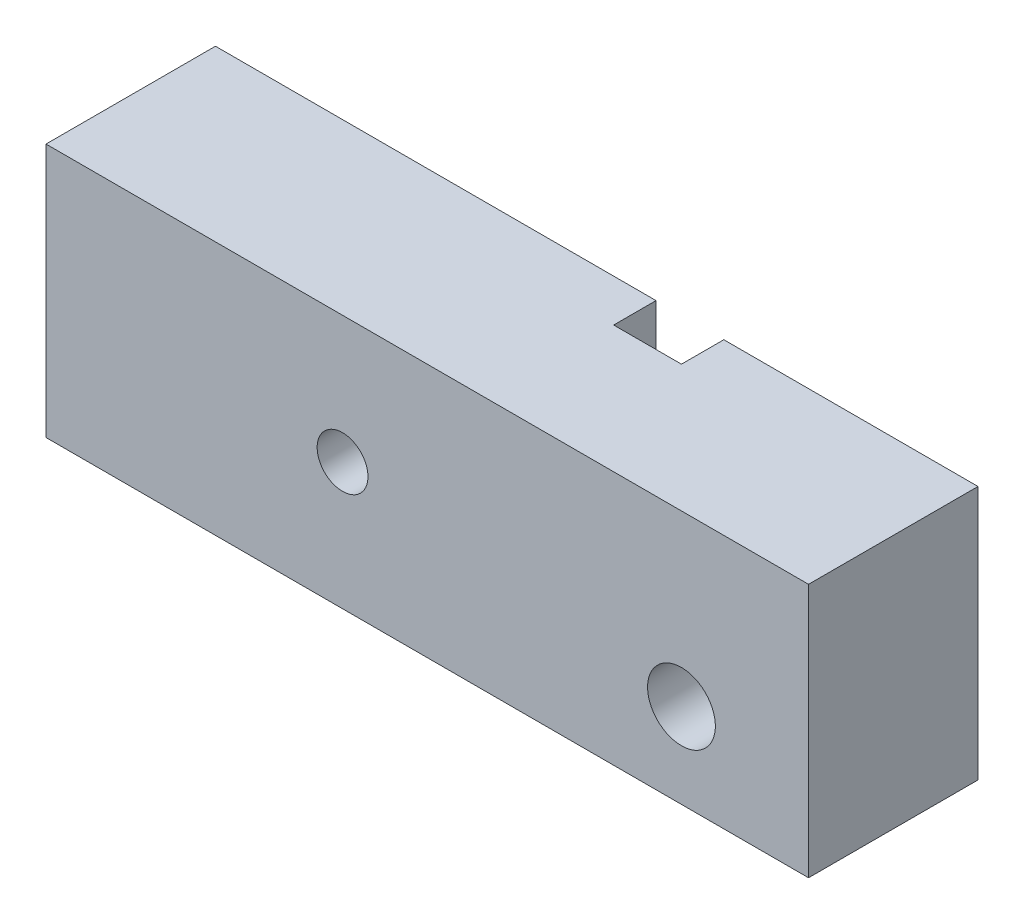
ISO-10303-21;
HEADER;
FILE_DESCRIPTION(('STEP AP214'),'2;1');
FILE_NAME('part.step','',(''),(''),'','','');
FILE_SCHEMA(('AUTOMOTIVE_DESIGN { 1 0 10303 214 1 1 1 1 }'));
ENDSEC;
DATA;
#1=APPLICATION_CONTEXT('core data for automotive mechanical design processes');
#2=APPLICATION_PROTOCOL_DEFINITION('international standard','automotive_design',2000,#1);
#3=PRODUCT_CONTEXT('',#1,'mechanical');
#4=PRODUCT('Part','Part','',(#3));
#5=PRODUCT_RELATED_PRODUCT_CATEGORY('part','',(#4));
#6=PRODUCT_DEFINITION_FORMATION('','',#4);
#7=PRODUCT_DEFINITION_CONTEXT('part definition',#1,'design');
#8=PRODUCT_DEFINITION('design','',#6,#7);
#9=PRODUCT_DEFINITION_SHAPE('','',#8);
#10=(LENGTH_UNIT() NAMED_UNIT(*) SI_UNIT(.MILLI.,.METRE.));
#11=(NAMED_UNIT(*) PLANE_ANGLE_UNIT() SI_UNIT($,.RADIAN.));
#12=(NAMED_UNIT(*) SI_UNIT($,.STERADIAN.) SOLID_ANGLE_UNIT());
#13=UNCERTAINTY_MEASURE_WITH_UNIT(LENGTH_MEASURE(1.E-05),#10,'distance_accuracy_value','');
#14=(GEOMETRIC_REPRESENTATION_CONTEXT(3) GLOBAL_UNCERTAINTY_ASSIGNED_CONTEXT((#13)) GLOBAL_UNIT_ASSIGNED_CONTEXT((#10,
#11,#12)) REPRESENTATION_CONTEXT('',''));
#15=CARTESIAN_POINT('',(0.,0.,0.));
#16=DIRECTION('',(0.,0.,1.));
#17=DIRECTION('',(1.,0.,0.));
#18=AXIS2_PLACEMENT_3D('',#15,#16,#17);
#19=CARTESIAN_POINT('',(0.,0.,0.));
#20=DIRECTION('',(0.,0.,-1.));
#21=DIRECTION('',(-1.,0.,0.));
#22=AXIS2_PLACEMENT_3D('',#19,#20,#21);
#23=PLANE('',#22);
#24=DIRECTION('',(0.,1.,0.));
#25=VECTOR('',#24,1.);
#26=CARTESIAN_POINT('',(7.00000000000001,-15.,0.));
#27=LINE('',#26,#25);
#28=CARTESIAN_POINT('',(7.00000000000001,-15.,0.));
#29=VERTEX_POINT('',#28);
#30=CARTESIAN_POINT('',(7.00000000000001,15.,0.));
#31=VERTEX_POINT('',#30);
#32=EDGE_CURVE('E158',#29,#31,#27,.T.);
#33=ORIENTED_EDGE('',*,*,#32,.F.);
#34=DIRECTION('',(1.,0.,0.));
#35=VECTOR('',#34,1.);
#36=CARTESIAN_POINT('',(-45.,-15.,0.));
#37=LINE('',#36,#35);
#38=CARTESIAN_POINT('',(-45.,-15.,0.));
#39=VERTEX_POINT('',#38);
#40=EDGE_CURVE('E145',#39,#29,#37,.T.);
#41=ORIENTED_EDGE('',*,*,#40,.F.);
#42=DIRECTION('',(0.,-1.,0.));
#43=VECTOR('',#42,1.);
#44=CARTESIAN_POINT('',(-45.,-15.,0.));
#45=LINE('',#44,#43);
#46=CARTESIAN_POINT('',(-45.,15.,0.));
#47=VERTEX_POINT('',#46);
#48=EDGE_CURVE('E196',#47,#39,#45,.T.);
#49=ORIENTED_EDGE('',*,*,#48,.F.);
#50=DIRECTION('',(-1.,0.,0.));
#51=VECTOR('',#50,1.);
#52=CARTESIAN_POINT('',(-45.,15.,0.));
#53=LINE('',#52,#51);
#54=EDGE_CURVE('E192',#31,#47,#53,.T.);
#55=ORIENTED_EDGE('',*,*,#54,.F.);
#56=EDGE_LOOP('',(#33,#41,#49,#55));
#57=FACE_BOUND('',#56,.T.);
#58=CARTESIAN_POINT('',(-30.,0.,0.));
#59=DIRECTION('',(0.,0.,-1.));
#60=DIRECTION('',(-1.,0.,0.));
#61=AXIS2_PLACEMENT_3D('',#58,#59,#60);
#62=CIRCLE('',#61,3.99999999999999);
#63=CARTESIAN_POINT('',(-34.,0.,0.));
#64=VERTEX_POINT('',#63);
#65=EDGE_CURVE('E174',#64,#64,#62,.T.);
#66=ORIENTED_EDGE('',*,*,#65,.F.);
#67=EDGE_LOOP('',(#66));
#68=FACE_BOUND('',#67,.T.);
#69=CARTESIAN_POINT('',(-9.99999999999998,0.,0.));
#70=DIRECTION('',(0.,0.,-1.));
#71=DIRECTION('',(-1.,0.,0.));
#72=AXIS2_PLACEMENT_3D('',#69,#70,#71);
#73=CIRCLE('',#72,6.);
#74=CARTESIAN_POINT('',(-16.,0.,0.));
#75=VERTEX_POINT('',#74);
#76=EDGE_CURVE('E168',#75,#75,#73,.T.);
#77=ORIENTED_EDGE('',*,*,#76,.F.);
#78=EDGE_LOOP('',(#77));
#79=FACE_BOUND('',#78,.T.);
#80=ADVANCED_FACE('F49',(#57,#68,#79),#23,.T.);
#81=CARTESIAN_POINT('',(30.,-5.,0.));
#82=DIRECTION('',(0.,0.,-1.));
#83=DIRECTION('',(-1.,0.,0.));
#84=AXIS2_PLACEMENT_3D('',#81,#82,#83);
#85=CIRCLE('',#84,4.00000000000001);
#86=CARTESIAN_POINT('',(26.,-5.,0.));
#87=VERTEX_POINT('',#86);
#88=EDGE_CURVE('E151',#87,#87,#85,.T.);
#89=ORIENTED_EDGE('',*,*,#88,.F.);
#90=EDGE_LOOP('',(#89));
#91=FACE_BOUND('',#90,.T.);
#92=DIRECTION('',(0.,1.,0.));
#93=VECTOR('',#92,1.);
#94=CARTESIAN_POINT('',(15.,-15.,0.));
#95=LINE('',#94,#93);
#96=CARTESIAN_POINT('',(15.,-15.,0.));
#97=VERTEX_POINT('',#96);
#98=CARTESIAN_POINT('',(15.,15.,0.));
#99=VERTEX_POINT('',#98);
#100=EDGE_CURVE('E161',#97,#99,#95,.T.);
#101=ORIENTED_EDGE('',*,*,#100,.T.);
#102=CARTESIAN_POINT('',(45.,15.,0.));
#103=VERTEX_POINT('',#102);
#104=EDGE_CURVE('E193',#103,#99,#53,.T.);
#105=ORIENTED_EDGE('',*,*,#104,.F.);
#106=DIRECTION('',(0.,1.,0.));
#107=VECTOR('',#106,1.);
#108=CARTESIAN_POINT('',(45.,-15.,0.));
#109=LINE('',#108,#107);
#110=CARTESIAN_POINT('',(45.,-15.,0.));
#111=VERTEX_POINT('',#110);
#112=EDGE_CURVE('E182',#111,#103,#109,.T.);
#113=ORIENTED_EDGE('',*,*,#112,.F.);
#114=EDGE_CURVE('E93',#97,#111,#37,.T.);
#115=ORIENTED_EDGE('',*,*,#114,.F.);
#116=EDGE_LOOP('',(#101,#105,#113,#115));
#117=FACE_BOUND('',#116,.T.);
#118=ADVANCED_FACE('F214',(#91,#117),#23,.T.);
#119=CARTESIAN_POINT('',(45.,-15.,20.));
#120=DIRECTION('',(-1.,0.,0.));
#121=DIRECTION('',(0.,0.,1.));
#122=AXIS2_PLACEMENT_3D('',#119,#120,#121);
#123=PLANE('',#122);
#124=ORIENTED_EDGE('',*,*,#112,.T.);
#125=DIRECTION('',(0.,0.,-1.));
#126=VECTOR('',#125,1.);
#127=CARTESIAN_POINT('',(45.,15.,20.));
#128=LINE('',#127,#126);
#129=CARTESIAN_POINT('',(45.,15.,20.));
#130=VERTEX_POINT('',#129);
#131=EDGE_CURVE('E13',#130,#103,#128,.T.);
#132=ORIENTED_EDGE('',*,*,#131,.F.);
#133=DIRECTION('',(0.,1.,0.));
#134=VECTOR('',#133,1.);
#135=CARTESIAN_POINT('',(45.,-15.,20.));
#136=LINE('',#135,#134);
#137=CARTESIAN_POINT('',(45.,-15.,20.));
#138=VERTEX_POINT('',#137);
#139=EDGE_CURVE('E183',#138,#130,#136,.T.);
#140=ORIENTED_EDGE('',*,*,#139,.F.);
#141=DIRECTION('',(0.,0.,-1.));
#142=VECTOR('',#141,1.);
#143=CARTESIAN_POINT('',(45.,-15.,20.));
#144=LINE('',#143,#142);
#145=EDGE_CURVE('E189',#138,#111,#144,.T.);
#146=ORIENTED_EDGE('',*,*,#145,.T.);
#147=EDGE_LOOP('',(#124,#132,#140,#146));
#148=FACE_BOUND('',#147,.T.);
#149=ADVANCED_FACE('F51',(#148),#123,.F.);
#150=CARTESIAN_POINT('',(-45.,15.,20.));
#151=DIRECTION('',(0.,-1.,0.));
#152=DIRECTION('',(0.,0.,-1.));
#153=AXIS2_PLACEMENT_3D('',#150,#151,#152);
#154=PLANE('',#153);
#155=DIRECTION('',(1.,0.,0.));
#156=VECTOR('',#155,1.);
#157=CARTESIAN_POINT('',(7.00000000000001,15.,5.));
#158=LINE('',#157,#156);
#159=CARTESIAN_POINT('',(7.00000000000001,15.,5.));
#160=VERTEX_POINT('',#159);
#161=CARTESIAN_POINT('',(15.,15.,5.));
#162=VERTEX_POINT('',#161);
#163=EDGE_CURVE('E148',#160,#162,#158,.T.);
#164=ORIENTED_EDGE('',*,*,#163,.F.);
#165=DIRECTION('',(0.,0.,1.));
#166=VECTOR('',#165,1.);
#167=CARTESIAN_POINT('',(7.00000000000001,15.,0.));
#168=LINE('',#167,#166);
#169=EDGE_CURVE('E131',#31,#160,#168,.T.);
#170=ORIENTED_EDGE('',*,*,#169,.F.);
#171=ORIENTED_EDGE('',*,*,#54,.T.);
#172=DIRECTION('',(0.,0.,-1.));
#173=VECTOR('',#172,1.);
#174=CARTESIAN_POINT('',(-45.,15.,20.));
#175=LINE('',#174,#173);
#176=CARTESIAN_POINT('',(-45.,15.,20.));
#177=VERTEX_POINT('',#176);
#178=EDGE_CURVE('E57',#177,#47,#175,.T.);
#179=ORIENTED_EDGE('',*,*,#178,.F.);
#180=DIRECTION('',(-1.,0.,0.));
#181=VECTOR('',#180,1.);
#182=CARTESIAN_POINT('',(-45.,15.,20.));
#183=LINE('',#182,#181);
#184=EDGE_CURVE('E100',#130,#177,#183,.T.);
#185=ORIENTED_EDGE('',*,*,#184,.F.);
#186=ORIENTED_EDGE('',*,*,#131,.T.);
#187=ORIENTED_EDGE('',*,*,#104,.T.);
#188=DIRECTION('',(0.,0.,-1.));
#189=VECTOR('',#188,1.);
#190=CARTESIAN_POINT('',(15.,15.,0.));
#191=LINE('',#190,#189);
#192=EDGE_CURVE('E146',#162,#99,#191,.T.);
#193=ORIENTED_EDGE('',*,*,#192,.F.);
#194=EDGE_LOOP('',(#164,#170,#171,#179,#185,#186,#187,#193));
#195=FACE_BOUND('',#194,.T.);
#196=ADVANCED_FACE('F210',(#195),#154,.F.);
#197=CARTESIAN_POINT('',(-45.,-15.,20.));
#198=DIRECTION('',(1.,0.,0.));
#199=DIRECTION('',(0.,0.,-1.));
#200=AXIS2_PLACEMENT_3D('',#197,#198,#199);
#201=PLANE('',#200);
#202=ORIENTED_EDGE('',*,*,#48,.T.);
#203=DIRECTION('',(0.,0.,-1.));
#204=VECTOR('',#203,1.);
#205=CARTESIAN_POINT('',(-45.,-15.,20.));
#206=LINE('',#205,#204);
#207=CARTESIAN_POINT('',(-45.,-15.,20.));
#208=VERTEX_POINT('',#207);
#209=EDGE_CURVE('E200',#208,#39,#206,.T.);
#210=ORIENTED_EDGE('',*,*,#209,.F.);
#211=DIRECTION('',(0.,-1.,0.));
#212=VECTOR('',#211,1.);
#213=CARTESIAN_POINT('',(-45.,-15.,20.));
#214=LINE('',#213,#212);
#215=EDGE_CURVE('E186',#177,#208,#214,.T.);
#216=ORIENTED_EDGE('',*,*,#215,.F.);
#217=ORIENTED_EDGE('',*,*,#178,.T.);
#218=EDGE_LOOP('',(#202,#210,#216,#217));
#219=FACE_BOUND('',#218,.T.);
#220=ADVANCED_FACE('F205',(#219),#201,.F.);
#221=CARTESIAN_POINT('',(-45.,-15.,20.));
#222=DIRECTION('',(0.,1.,0.));
#223=DIRECTION('',(0.,0.,1.));
#224=AXIS2_PLACEMENT_3D('',#221,#222,#223);
#225=PLANE('',#224);
#226=ORIENTED_EDGE('',*,*,#40,.T.);
#227=DIRECTION('',(0.,0.,1.));
#228=VECTOR('',#227,1.);
#229=CARTESIAN_POINT('',(7.00000000000001,-15.,0.));
#230=LINE('',#229,#228);
#231=CARTESIAN_POINT('',(7.00000000000001,-15.,5.));
#232=VERTEX_POINT('',#231);
#233=EDGE_CURVE('E128',#29,#232,#230,.T.);
#234=ORIENTED_EDGE('',*,*,#233,.T.);
#235=DIRECTION('',(1.,0.,0.));
#236=VECTOR('',#235,1.);
#237=CARTESIAN_POINT('',(7.00000000000001,-15.,5.));
#238=LINE('',#237,#236);
#239=CARTESIAN_POINT('',(15.,-15.,5.));
#240=VERTEX_POINT('',#239);
#241=EDGE_CURVE('E138',#232,#240,#238,.T.);
#242=ORIENTED_EDGE('',*,*,#241,.T.);
#243=DIRECTION('',(0.,0.,-1.));
#244=VECTOR('',#243,1.);
#245=CARTESIAN_POINT('',(15.,-15.,0.));
#246=LINE('',#245,#244);
#247=EDGE_CURVE('E64',#240,#97,#246,.T.);
#248=ORIENTED_EDGE('',*,*,#247,.T.);
#249=ORIENTED_EDGE('',*,*,#114,.T.);
#250=ORIENTED_EDGE('',*,*,#145,.F.);
#251=DIRECTION('',(1.,0.,0.));
#252=VECTOR('',#251,1.);
#253=CARTESIAN_POINT('',(-45.,-15.,20.));
#254=LINE('',#253,#252);
#255=EDGE_CURVE('E73',#208,#138,#254,.T.);
#256=ORIENTED_EDGE('',*,*,#255,.F.);
#257=ORIENTED_EDGE('',*,*,#209,.T.);
#258=EDGE_LOOP('',(#226,#234,#242,#248,#249,#250,#256,#257));
#259=FACE_BOUND('',#258,.T.);
#260=ADVANCED_FACE('F142',(#259),#225,.F.);
#261=CARTESIAN_POINT('',(0.,0.,20.));
#262=DIRECTION('',(0.,0.,-1.));
#263=DIRECTION('',(-1.,0.,0.));
#264=AXIS2_PLACEMENT_3D('',#261,#262,#263);
#265=PLANE('',#264);
#266=CARTESIAN_POINT('',(30.,-5.,20.));
#267=DIRECTION('',(0.,0.,-1.));
#268=DIRECTION('',(-1.,0.,0.));
#269=AXIS2_PLACEMENT_3D('',#266,#267,#268);
#270=CIRCLE('',#269,4.00000000000001);
#271=CARTESIAN_POINT('',(26.,-5.,20.));
#272=VERTEX_POINT('',#271);
#273=EDGE_CURVE('E156',#272,#272,#270,.T.);
#274=ORIENTED_EDGE('',*,*,#273,.T.);
#275=EDGE_LOOP('',(#274));
#276=FACE_BOUND('',#275,.T.);
#277=CARTESIAN_POINT('',(-9.99999999999998,0.,20.));
#278=DIRECTION('',(0.,0.,-1.));
#279=DIRECTION('',(-1.,0.,0.));
#280=AXIS2_PLACEMENT_3D('',#277,#278,#279);
#281=CIRCLE('',#280,3.);
#282=CARTESIAN_POINT('',(-13.,0.,20.));
#283=VERTEX_POINT('',#282);
#284=EDGE_CURVE('E165',#283,#283,#281,.T.);
#285=ORIENTED_EDGE('',*,*,#284,.T.);
#286=EDGE_LOOP('',(#285));
#287=FACE_BOUND('',#286,.T.);
#288=ORIENTED_EDGE('',*,*,#139,.T.);
#289=ORIENTED_EDGE('',*,*,#184,.T.);
#290=ORIENTED_EDGE('',*,*,#215,.T.);
#291=ORIENTED_EDGE('',*,*,#255,.T.);
#292=EDGE_LOOP('',(#288,#289,#290,#291));
#293=FACE_BOUND('',#292,.T.);
#294=ADVANCED_FACE('F219',(#276,#287,#293),#265,.F.);
#295=CARTESIAN_POINT('',(-30.,0.,14.));
#296=DIRECTION('',(0.,0.,-1.));
#297=DIRECTION('',(-1.,0.,0.));
#298=AXIS2_PLACEMENT_3D('',#295,#296,#297);
#299=CONICAL_SURFACE('',#298,0.,0.785398163397449);
#300=CARTESIAN_POINT('',(-30.,0.,10.));
#301=DIRECTION('',(0.,0.,-1.));
#302=DIRECTION('',(-1.,0.,0.));
#303=AXIS2_PLACEMENT_3D('',#300,#301,#302);
#304=CIRCLE('',#303,4.);
#305=CARTESIAN_POINT('',(-34.,0.,10.));
#306=VERTEX_POINT('',#305);
#307=EDGE_CURVE('E179',#306,#306,#304,.T.);
#308=ORIENTED_EDGE('',*,*,#307,.T.);
#309=EDGE_LOOP('',(#308));
#310=FACE_BOUND('',#309,.T.);
#311=CARTESIAN_POINT('',(-30.,0.,14.));
#312=VERTEX_POINT('',#311);
#313=VERTEX_LOOP('',#312);
#314=FACE_BOUND('',#313,.T.);
#315=ADVANCED_FACE('F221',(#310,#314),#299,.F.);
#316=CARTESIAN_POINT('',(-30.,0.,0.));
#317=DIRECTION('',(0.,0.,-1.));
#318=DIRECTION('',(-1.,0.,0.));
#319=AXIS2_PLACEMENT_3D('',#316,#317,#318);
#320=CYLINDRICAL_SURFACE('',#319,3.99999999999999);
#321=ORIENTED_EDGE('',*,*,#65,.T.);
#322=EDGE_LOOP('',(#321));
#323=FACE_BOUND('',#322,.T.);
#324=ORIENTED_EDGE('',*,*,#307,.F.);
#325=EDGE_LOOP('',(#324));
#326=FACE_BOUND('',#325,.T.);
#327=ADVANCED_FACE('F228',(#323,#326),#320,.F.);
#328=CARTESIAN_POINT('',(-9.99999999999998,0.,12.));
#329=DIRECTION('',(0.,0.,-1.));
#330=DIRECTION('',(-1.,0.,0.));
#331=AXIS2_PLACEMENT_3D('',#328,#329,#330);
#332=CYLINDRICAL_SURFACE('',#331,6.);
#333=CARTESIAN_POINT('',(-9.99999999999998,0.,12.));
#334=DIRECTION('',(0.,0.,-1.));
#335=DIRECTION('',(-1.,0.,0.));
#336=AXIS2_PLACEMENT_3D('',#333,#334,#335);
#337=CIRCLE('',#336,6.);
#338=CARTESIAN_POINT('',(-16.,0.,12.));
#339=VERTEX_POINT('',#338);
#340=EDGE_CURVE('E171',#339,#339,#337,.T.);
#341=ORIENTED_EDGE('',*,*,#340,.F.);
#342=EDGE_LOOP('',(#341));
#343=FACE_BOUND('',#342,.T.);
#344=ORIENTED_EDGE('',*,*,#76,.T.);
#345=EDGE_LOOP('',(#344));
#346=FACE_BOUND('',#345,.T.);
#347=ADVANCED_FACE('F305',(#343,#346),#332,.F.);
#348=CARTESIAN_POINT('',(-9.99999999999998,0.,12.));
#349=DIRECTION('',(0.,0.,-1.));
#350=DIRECTION('',(-1.,0.,0.));
#351=AXIS2_PLACEMENT_3D('',#348,#349,#350);
#352=PLANE('',#351);
#353=CARTESIAN_POINT('',(-9.99999999999998,0.,12.));
#354=DIRECTION('',(0.,0.,-1.));
#355=DIRECTION('',(-1.,0.,0.));
#356=AXIS2_PLACEMENT_3D('',#353,#354,#355);
#357=CIRCLE('',#356,3.);
#358=CARTESIAN_POINT('',(-13.,0.,12.));
#359=VERTEX_POINT('',#358);
#360=EDGE_CURVE('E160',#359,#359,#357,.T.);
#361=ORIENTED_EDGE('',*,*,#360,.F.);
#362=EDGE_LOOP('',(#361));
#363=FACE_BOUND('',#362,.T.);
#364=ORIENTED_EDGE('',*,*,#340,.T.);
#365=EDGE_LOOP('',(#364));
#366=FACE_BOUND('',#365,.T.);
#367=ADVANCED_FACE('F297',(#363,#366),#352,.T.);
#368=CARTESIAN_POINT('',(-9.99999999999998,0.,20.));
#369=DIRECTION('',(0.,0.,-1.));
#370=DIRECTION('',(-1.,0.,0.));
#371=AXIS2_PLACEMENT_3D('',#368,#369,#370);
#372=CYLINDRICAL_SURFACE('',#371,3.);
#373=ORIENTED_EDGE('',*,*,#284,.F.);
#374=EDGE_LOOP('',(#373));
#375=FACE_BOUND('',#374,.T.);
#376=ORIENTED_EDGE('',*,*,#360,.T.);
#377=EDGE_LOOP('',(#376));
#378=FACE_BOUND('',#377,.T.);
#379=ADVANCED_FACE('F289',(#375,#378),#372,.F.);
#380=CARTESIAN_POINT('',(7.00000000000001,-15.,0.));
#381=DIRECTION('',(-1.,0.,0.));
#382=DIRECTION('',(0.,0.,1.));
#383=AXIS2_PLACEMENT_3D('',#380,#381,#382);
#384=PLANE('',#383);
#385=ORIENTED_EDGE('',*,*,#169,.T.);
#386=DIRECTION('',(0.,1.,0.));
#387=VECTOR('',#386,1.);
#388=CARTESIAN_POINT('',(7.00000000000001,-15.,5.));
#389=LINE('',#388,#387);
#390=EDGE_CURVE('E124',#232,#160,#389,.T.);
#391=ORIENTED_EDGE('',*,*,#390,.F.);
#392=ORIENTED_EDGE('',*,*,#233,.F.);
#393=ORIENTED_EDGE('',*,*,#32,.T.);
#394=EDGE_LOOP('',(#385,#391,#392,#393));
#395=FACE_BOUND('',#394,.T.);
#396=ADVANCED_FACE('F126',(#395),#384,.F.);
#397=CARTESIAN_POINT('',(15.,-15.,0.));
#398=DIRECTION('',(1.,0.,0.));
#399=DIRECTION('',(0.,0.,-1.));
#400=AXIS2_PLACEMENT_3D('',#397,#398,#399);
#401=PLANE('',#400);
#402=ORIENTED_EDGE('',*,*,#192,.T.);
#403=ORIENTED_EDGE('',*,*,#100,.F.);
#404=ORIENTED_EDGE('',*,*,#247,.F.);
#405=DIRECTION('',(0.,1.,0.));
#406=VECTOR('',#405,1.);
#407=CARTESIAN_POINT('',(15.,-15.,5.));
#408=LINE('',#407,#406);
#409=EDGE_CURVE('E135',#240,#162,#408,.T.);
#410=ORIENTED_EDGE('',*,*,#409,.T.);
#411=EDGE_LOOP('',(#402,#403,#404,#410));
#412=FACE_BOUND('',#411,.T.);
#413=ADVANCED_FACE('F212',(#412),#401,.F.);
#414=CARTESIAN_POINT('',(7.00000000000001,-15.,5.));
#415=DIRECTION('',(0.,0.,1.));
#416=DIRECTION('',(1.,0.,0.));
#417=AXIS2_PLACEMENT_3D('',#414,#415,#416);
#418=PLANE('',#417);
#419=ORIENTED_EDGE('',*,*,#163,.T.);
#420=ORIENTED_EDGE('',*,*,#409,.F.);
#421=ORIENTED_EDGE('',*,*,#241,.F.);
#422=ORIENTED_EDGE('',*,*,#390,.T.);
#423=EDGE_LOOP('',(#419,#420,#421,#422));
#424=FACE_BOUND('',#423,.T.);
#425=ADVANCED_FACE('F139',(#424),#418,.F.);
#426=CARTESIAN_POINT('',(30.,-5.,20.));
#427=DIRECTION('',(0.,0.,-1.));
#428=DIRECTION('',(-1.,0.,0.));
#429=AXIS2_PLACEMENT_3D('',#426,#427,#428);
#430=CYLINDRICAL_SURFACE('',#429,4.00000000000001);
#431=ORIENTED_EDGE('',*,*,#273,.F.);
#432=EDGE_LOOP('',(#431));
#433=FACE_BOUND('',#432,.T.);
#434=ORIENTED_EDGE('',*,*,#88,.T.);
#435=EDGE_LOOP('',(#434));
#436=FACE_BOUND('',#435,.T.);
#437=ADVANCED_FACE('F269',(#433,#436),#430,.F.);
#438=CLOSED_SHELL('',(#80,#118,#149,#196,#220,#260,#294,#315,#327,#347,#367,#379,#396,#413,#425,#437));
#439=MANIFOLD_SOLID_BREP('B2',#438);
#440=ADVANCED_BREP_SHAPE_REPRESENTATION('',(#18,#439),#14);
#441=SHAPE_DEFINITION_REPRESENTATION(#9,#440);
ENDSEC;
END-ISO-10303-21;
